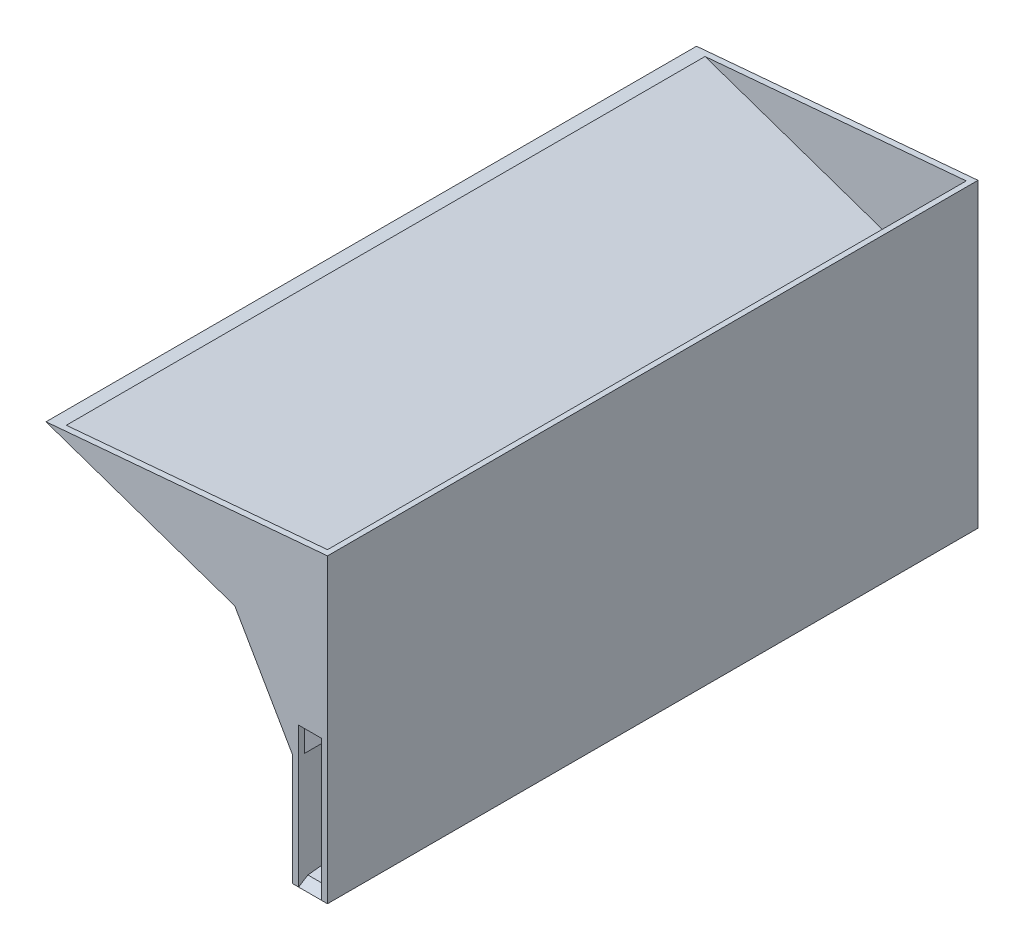
ISO-10303-21;
HEADER;
FILE_DESCRIPTION(('STEP AP214'),'2;1');
FILE_NAME('part.step','',(''),(''),'','','');
FILE_SCHEMA(('AUTOMOTIVE_DESIGN { 1 0 10303 214 1 1 1 1 }'));
ENDSEC;
DATA;
#1=APPLICATION_CONTEXT('core data for automotive mechanical design processes');
#2=APPLICATION_PROTOCOL_DEFINITION('international standard','automotive_design',2000,#1);
#3=PRODUCT_CONTEXT('',#1,'mechanical');
#4=PRODUCT('Part','Part','',(#3));
#5=PRODUCT_RELATED_PRODUCT_CATEGORY('part','',(#4));
#6=PRODUCT_DEFINITION_FORMATION('','',#4);
#7=PRODUCT_DEFINITION_CONTEXT('part definition',#1,'design');
#8=PRODUCT_DEFINITION('design','',#6,#7);
#9=PRODUCT_DEFINITION_SHAPE('','',#8);
#10=(LENGTH_UNIT() NAMED_UNIT(*) SI_UNIT(.MILLI.,.METRE.));
#11=(NAMED_UNIT(*) PLANE_ANGLE_UNIT() SI_UNIT($,.RADIAN.));
#12=(NAMED_UNIT(*) SI_UNIT($,.STERADIAN.) SOLID_ANGLE_UNIT());
#13=UNCERTAINTY_MEASURE_WITH_UNIT(LENGTH_MEASURE(1.E-05),#10,'distance_accuracy_value','');
#14=(GEOMETRIC_REPRESENTATION_CONTEXT(3) GLOBAL_UNCERTAINTY_ASSIGNED_CONTEXT((#13)) GLOBAL_UNIT_ASSIGNED_CONTEXT((#10,
#11,#12)) REPRESENTATION_CONTEXT('',''));
#15=CARTESIAN_POINT('',(0.,0.,0.));
#16=DIRECTION('',(0.,0.,1.));
#17=DIRECTION('',(1.,0.,0.));
#18=AXIS2_PLACEMENT_3D('',#15,#16,#17);
#19=CARTESIAN_POINT('',(12.7,-240.,701.675));
#20=DIRECTION('',(1.,0.,0.));
#21=DIRECTION('',(0.,0.,-1.));
#22=AXIS2_PLACEMENT_3D('',#19,#20,#21);
#23=PLANE('',#22);
#24=DIRECTION('',(0.,-1.,0.));
#25=VECTOR('',#24,1.);
#26=CARTESIAN_POINT('',(12.7,-227.3,701.675));
#27=LINE('',#26,#25);
#28=CARTESIAN_POINT('',(12.7,62.7,701.675));
#29=VERTEX_POINT('',#28);
#30=CARTESIAN_POINT('',(12.7,-240.,701.675));
#31=VERTEX_POINT('',#30);
#32=EDGE_CURVE('E69',#29,#31,#27,.T.);
#33=ORIENTED_EDGE('',*,*,#32,.T.);
#34=DIRECTION('',(0.,-0.536055885401432,0.844182496695168));
#35=VECTOR('',#34,1.);
#36=CARTESIAN_POINT('',(12.7,-227.3,681.675));
#37=LINE('',#36,#35);
#38=CARTESIAN_POINT('',(12.7,-227.3,681.675));
#39=VERTEX_POINT('',#38);
#40=EDGE_CURVE('E11',#31,#39,#37,.F.);
#41=ORIENTED_EDGE('',*,*,#40,.T.);
#42=DIRECTION('',(0.,-0.104528463267647,0.994521895368274));
#43=VECTOR('',#42,1.);
#44=CARTESIAN_POINT('',(12.7,-83.2388799331101,-688.975));
#45=LINE('',#44,#43);
#46=CARTESIAN_POINT('',(12.7,-83.2388799331101,-688.975));
#47=VERTEX_POINT('',#46);
#48=EDGE_CURVE('E158',#47,#39,#45,.T.);
#49=ORIENTED_EDGE('',*,*,#48,.F.);
#50=DIRECTION('',(0.,-1.,0.));
#51=VECTOR('',#50,1.);
#52=CARTESIAN_POINT('',(12.7,-240.,-688.975));
#53=LINE('',#52,#51);
#54=CARTESIAN_POINT('',(12.7,3.40295474387527,-688.975));
#55=VERTEX_POINT('',#54);
#56=EDGE_CURVE('E170',#55,#47,#53,.T.);
#57=ORIENTED_EDGE('',*,*,#56,.F.);
#58=DIRECTION('',(0.,0.,-1.));
#59=VECTOR('',#58,1.);
#60=CARTESIAN_POINT('',(12.7,3.40295474387527,701.675));
#61=LINE('',#60,#59);
#62=CARTESIAN_POINT('',(12.7,3.40295474387527,688.975));
#63=VERTEX_POINT('',#62);
#64=EDGE_CURVE('E190',#63,#55,#61,.T.);
#65=ORIENTED_EDGE('',*,*,#64,.F.);
#66=DIRECTION('',(0.,-1.,0.));
#67=VECTOR('',#66,1.);
#68=CARTESIAN_POINT('',(12.7,0.,688.975));
#69=LINE('',#68,#67);
#70=CARTESIAN_POINT('',(12.7,62.7,688.975));
#71=VERTEX_POINT('',#70);
#72=EDGE_CURVE('E295',#71,#63,#69,.T.);
#73=ORIENTED_EDGE('',*,*,#72,.F.);
#74=DIRECTION('',(0.,0.,1.));
#75=VECTOR('',#74,1.);
#76=CARTESIAN_POINT('',(12.7,62.7,681.675));
#77=LINE('',#76,#75);
#78=EDGE_CURVE('E180',#71,#29,#77,.T.);
#79=ORIENTED_EDGE('',*,*,#78,.T.);
#80=EDGE_LOOP('',(#33,#41,#49,#57,#65,#73,#79));
#81=FACE_BOUND('',#80,.T.);
#82=ADVANCED_FACE('F45',(#81),#23,.T.);
#83=CARTESIAN_POINT('',(62.2999999999999,410.,701.675));
#84=DIRECTION('',(-1.,0.,0.));
#85=DIRECTION('',(0.,-1.,0.));
#86=AXIS2_PLACEMENT_3D('',#83,#84,#85);
#87=PLANE('',#86);
#88=DIRECTION('',(0.,1.,0.));
#89=VECTOR('',#88,1.);
#90=CARTESIAN_POINT('',(62.2999999999999,410.,-688.975));
#91=LINE('',#90,#89);
#92=CARTESIAN_POINT('',(62.3,-83.2388799331101,-688.975));
#93=VERTEX_POINT('',#92);
#94=CARTESIAN_POINT('',(62.2999999999999,408.888893973221,-688.975));
#95=VERTEX_POINT('',#94);
#96=EDGE_CURVE('E179',#93,#95,#91,.T.);
#97=ORIENTED_EDGE('',*,*,#96,.F.);
#98=DIRECTION('',(0.,0.104528463267647,-0.994521895368274));
#99=VECTOR('',#98,1.);
#100=CARTESIAN_POINT('',(62.3,-83.2388799331101,-688.975));
#101=LINE('',#100,#99);
#102=CARTESIAN_POINT('',(62.3,-227.3,681.675));
#103=VERTEX_POINT('',#102);
#104=EDGE_CURVE('E161',#103,#93,#101,.T.);
#105=ORIENTED_EDGE('',*,*,#104,.F.);
#106=DIRECTION('',(0.,0.536055885401432,-0.844182496695168));
#107=VECTOR('',#106,1.);
#108=CARTESIAN_POINT('',(62.3,-227.3,681.675));
#109=LINE('',#108,#107);
#110=CARTESIAN_POINT('',(62.3,-240.,701.675));
#111=VERTEX_POINT('',#110);
#112=EDGE_CURVE('E55',#103,#111,#109,.F.);
#113=ORIENTED_EDGE('',*,*,#112,.T.);
#114=DIRECTION('',(0.,1.,0.));
#115=VECTOR('',#114,1.);
#116=CARTESIAN_POINT('',(62.3,-227.3,701.675));
#117=LINE('',#116,#115);
#118=CARTESIAN_POINT('',(62.3,62.7,701.675));
#119=VERTEX_POINT('',#118);
#120=EDGE_CURVE('E62',#111,#119,#117,.T.);
#121=ORIENTED_EDGE('',*,*,#120,.T.);
#122=DIRECTION('',(0.,0.,1.));
#123=VECTOR('',#122,1.);
#124=CARTESIAN_POINT('',(62.3,62.7,681.675));
#125=LINE('',#124,#123);
#126=CARTESIAN_POINT('',(62.3,62.7,688.975));
#127=VERTEX_POINT('',#126);
#128=EDGE_CURVE('E186',#127,#119,#125,.T.);
#129=ORIENTED_EDGE('',*,*,#128,.F.);
#130=DIRECTION('',(0.,1.,0.));
#131=VECTOR('',#130,1.);
#132=CARTESIAN_POINT('',(62.2999999999999,410.,688.975));
#133=LINE('',#132,#131);
#134=CARTESIAN_POINT('',(62.2999999999999,408.888893973221,688.975));
#135=VERTEX_POINT('',#134);
#136=EDGE_CURVE('E195',#127,#135,#133,.T.);
#137=ORIENTED_EDGE('',*,*,#136,.T.);
#138=DIRECTION('',(0.,0.,-1.));
#139=VECTOR('',#138,1.);
#140=CARTESIAN_POINT('',(62.2999999999999,408.888893973221,701.675));
#141=LINE('',#140,#139);
#142=EDGE_CURVE('E214',#135,#95,#141,.T.);
#143=ORIENTED_EDGE('',*,*,#142,.T.);
#144=EDGE_LOOP('',(#97,#105,#113,#121,#129,#137,#143));
#145=FACE_BOUND('',#144,.T.);
#146=ADVANCED_FACE('F300',(#145),#87,.T.);
#147=CARTESIAN_POINT('',(0.,0.,-688.975));
#148=DIRECTION('',(0.,0.,1.));
#149=DIRECTION('',(1.,0.,0.));
#150=AXIS2_PLACEMENT_3D('',#147,#148,#149);
#151=PLANE('',#150);
#152=ORIENTED_EDGE('',*,*,#56,.T.);
#153=DIRECTION('',(-1.,0.,0.));
#154=VECTOR('',#153,1.);
#155=CARTESIAN_POINT('',(1440.49992338373,-83.2388799331101,-688.975));
#156=LINE('',#155,#154);
#157=EDGE_CURVE('E154',#93,#47,#156,.T.);
#158=ORIENTED_EDGE('',*,*,#157,.F.);
#159=ORIENTED_EDGE('',*,*,#96,.T.);
#160=DIRECTION('',(-0.996194698091745,-0.0871557427476619,0.));
#161=VECTOR('',#160,1.);
#162=CARTESIAN_POINT('',(-532.280287956728,356.869859221025,-688.975));
#163=LINE('',#162,#161);
#164=CARTESIAN_POINT('',(-501.194225332028,359.589537294344,-688.975));
#165=VERTEX_POINT('',#164);
#166=EDGE_CURVE('E184',#95,#165,#163,.T.);
#167=ORIENTED_EDGE('',*,*,#166,.T.);
#168=DIRECTION('',(0.945428747100509,-0.32582891853849,0.));
#169=VECTOR('',#168,1.);
#170=CARTESIAN_POINT('',(-120.861972734562,228.513296034286,-688.975));
#171=LINE('',#170,#169);
#172=CARTESIAN_POINT('',(-116.374647054769,226.966801411755,-688.975));
#173=VERTEX_POINT('',#172);
#174=EDGE_CURVE('E205',#165,#173,#171,.T.);
#175=ORIENTED_EDGE('',*,*,#174,.T.);
#176=DIRECTION('',(0.500000000000001,-0.866025403784438,0.));
#177=VECTOR('',#176,1.);
#178=CARTESIAN_POINT('',(10.9985226280624,6.35000000000002,-688.975));
#179=LINE('',#178,#177);
#180=EDGE_CURVE('E177',#173,#55,#179,.T.);
#181=ORIENTED_EDGE('',*,*,#180,.T.);
#182=EDGE_LOOP('',(#152,#158,#159,#167,#175,#181));
#183=FACE_BOUND('',#182,.T.);
#184=ADVANCED_FACE('F175',(#183),#151,.T.);
#185=CARTESIAN_POINT('',(-532.280287956728,356.869859221025,701.675));
#186=DIRECTION('',(0.0871557427476619,-0.996194698091745,0.));
#187=DIRECTION('',(0.996194698091745,0.0871557427476619,0.));
#188=AXIS2_PLACEMENT_3D('',#185,#186,#187);
#189=PLANE('',#188);
#190=DIRECTION('',(-0.996194698091745,-0.0871557427476619,0.));
#191=VECTOR('',#190,1.);
#192=CARTESIAN_POINT('',(-532.280287956728,356.869859221025,-701.675));
#193=LINE('',#192,#191);
#194=CARTESIAN_POINT('',(74.9999999999999,410.,-701.675));
#195=VERTEX_POINT('',#194);
#196=CARTESIAN_POINT('',(-532.280287956728,356.869859221025,-701.675));
#197=VERTEX_POINT('',#196);
#198=EDGE_CURVE('E260',#195,#197,#193,.T.);
#199=ORIENTED_EDGE('',*,*,#198,.T.);
#200=DIRECTION('',(0.,0.,-1.));
#201=VECTOR('',#200,1.);
#202=CARTESIAN_POINT('',(-532.280287956728,356.869859221025,701.675));
#203=LINE('',#202,#201);
#204=CARTESIAN_POINT('',(-532.280287956728,356.869859221025,701.675));
#205=VERTEX_POINT('',#204);
#206=EDGE_CURVE('E275',#205,#197,#203,.T.);
#207=ORIENTED_EDGE('',*,*,#206,.F.);
#208=DIRECTION('',(-0.996194698091745,-0.0871557427476619,0.));
#209=VECTOR('',#208,1.);
#210=CARTESIAN_POINT('',(-532.280287956728,356.869859221025,701.675));
#211=LINE('',#210,#209);
#212=CARTESIAN_POINT('',(74.9999999999999,410.,701.675));
#213=VERTEX_POINT('',#212);
#214=EDGE_CURVE('E241',#213,#205,#211,.T.);
#215=ORIENTED_EDGE('',*,*,#214,.F.);
#216=DIRECTION('',(0.,0.,-1.));
#217=VECTOR('',#216,1.);
#218=CARTESIAN_POINT('',(74.9999999999999,410.,701.675));
#219=LINE('',#218,#217);
#220=EDGE_CURVE('E279',#213,#195,#219,.T.);
#221=ORIENTED_EDGE('',*,*,#220,.T.);
#222=EDGE_LOOP('',(#199,#207,#215,#221));
#223=FACE_BOUND('',#222,.T.);
#224=ORIENTED_EDGE('',*,*,#166,.F.);
#225=ORIENTED_EDGE('',*,*,#142,.F.);
#226=DIRECTION('',(-0.996194698091745,-0.0871557427476619,0.));
#227=VECTOR('',#226,1.);
#228=CARTESIAN_POINT('',(-532.280287956728,356.869859221025,688.975));
#229=LINE('',#228,#227);
#230=CARTESIAN_POINT('',(-501.194225332028,359.589537294344,688.975));
#231=VERTEX_POINT('',#230);
#232=EDGE_CURVE('E198',#135,#231,#229,.T.);
#233=ORIENTED_EDGE('',*,*,#232,.T.);
#234=DIRECTION('',(0.,0.,-1.));
#235=VECTOR('',#234,1.);
#236=CARTESIAN_POINT('',(-501.194225332028,359.589537294344,701.675));
#237=LINE('',#236,#235);
#238=EDGE_CURVE('E211',#231,#165,#237,.T.);
#239=ORIENTED_EDGE('',*,*,#238,.T.);
#240=EDGE_LOOP('',(#224,#225,#233,#239));
#241=FACE_BOUND('',#240,.T.);
#242=ADVANCED_FACE('F335',(#223,#241),#189,.F.);
#243=CARTESIAN_POINT('',(0.,-240.,701.675));
#244=DIRECTION('',(1.,0.,0.));
#245=DIRECTION('',(0.,0.,-1.));
#246=AXIS2_PLACEMENT_3D('',#243,#244,#245);
#247=PLANE('',#246);
#248=DIRECTION('',(0.,-1.,0.));
#249=VECTOR('',#248,1.);
#250=CARTESIAN_POINT('',(0.,-240.,-701.675));
#251=LINE('',#250,#249);
#252=CARTESIAN_POINT('',(0.,0.,-701.675));
#253=VERTEX_POINT('',#252);
#254=CARTESIAN_POINT('',(0.,-240.,-701.675));
#255=VERTEX_POINT('',#254);
#256=EDGE_CURVE('E218',#253,#255,#251,.T.);
#257=ORIENTED_EDGE('',*,*,#256,.T.);
#258=DIRECTION('',(0.,0.,-1.));
#259=VECTOR('',#258,1.);
#260=CARTESIAN_POINT('',(0.,-240.,701.675));
#261=LINE('',#260,#259);
#262=CARTESIAN_POINT('',(0.,-240.,701.675));
#263=VERTEX_POINT('',#262);
#264=EDGE_CURVE('E287',#263,#255,#261,.T.);
#265=ORIENTED_EDGE('',*,*,#264,.F.);
#266=DIRECTION('',(0.,-1.,0.));
#267=VECTOR('',#266,1.);
#268=CARTESIAN_POINT('',(0.,-240.,701.675));
#269=LINE('',#268,#267);
#270=CARTESIAN_POINT('',(0.,0.,701.675));
#271=VERTEX_POINT('',#270);
#272=EDGE_CURVE('E227',#271,#263,#269,.T.);
#273=ORIENTED_EDGE('',*,*,#272,.F.);
#274=DIRECTION('',(0.,0.,-1.));
#275=VECTOR('',#274,1.);
#276=CARTESIAN_POINT('',(0.,0.,701.675));
#277=LINE('',#276,#275);
#278=EDGE_CURVE('E250',#271,#253,#277,.T.);
#279=ORIENTED_EDGE('',*,*,#278,.T.);
#280=EDGE_LOOP('',(#257,#265,#273,#279));
#281=FACE_BOUND('',#280,.T.);
#282=ADVANCED_FACE('F398',(#281),#247,.F.);
#283=CARTESIAN_POINT('',(75.,-240.,701.675));
#284=DIRECTION('',(0.,1.,0.));
#285=DIRECTION('',(0.,0.,1.));
#286=AXIS2_PLACEMENT_3D('',#283,#284,#285);
#287=PLANE('',#286);
#288=DIRECTION('',(1.,0.,0.));
#289=VECTOR('',#288,1.);
#290=CARTESIAN_POINT('',(75.,-240.,-701.675));
#291=LINE('',#290,#289);
#292=CARTESIAN_POINT('',(75.,-240.,-701.675));
#293=VERTEX_POINT('',#292);
#294=EDGE_CURVE('E254',#255,#293,#291,.T.);
#295=ORIENTED_EDGE('',*,*,#294,.T.);
#296=DIRECTION('',(0.,0.,-1.));
#297=VECTOR('',#296,1.);
#298=CARTESIAN_POINT('',(75.,-240.,701.675));
#299=LINE('',#298,#297);
#300=CARTESIAN_POINT('',(75.,-240.,701.675));
#301=VERTEX_POINT('',#300);
#302=EDGE_CURVE('E283',#301,#293,#299,.T.);
#303=ORIENTED_EDGE('',*,*,#302,.F.);
#304=DIRECTION('',(1.,0.,0.));
#305=VECTOR('',#304,1.);
#306=CARTESIAN_POINT('',(75.,-240.,701.675));
#307=LINE('',#306,#305);
#308=EDGE_CURVE('E231',#111,#301,#307,.T.);
#309=ORIENTED_EDGE('',*,*,#308,.F.);
#310=EDGE_CURVE('E238',#31,#111,#307,.T.);
#311=ORIENTED_EDGE('',*,*,#310,.F.);
#312=EDGE_CURVE('E233',#263,#31,#307,.T.);
#313=ORIENTED_EDGE('',*,*,#312,.F.);
#314=ORIENTED_EDGE('',*,*,#264,.T.);
#315=EDGE_LOOP('',(#295,#303,#309,#311,#313,#314));
#316=FACE_BOUND('',#315,.T.);
#317=ADVANCED_FACE('F306',(#316),#287,.F.);
#318=CARTESIAN_POINT('',(74.9999999999999,410.,701.675));
#319=DIRECTION('',(-1.,0.,0.));
#320=DIRECTION('',(0.,-1.,0.));
#321=AXIS2_PLACEMENT_3D('',#318,#319,#320);
#322=PLANE('',#321);
#323=DIRECTION('',(0.,1.,0.));
#324=VECTOR('',#323,1.);
#325=CARTESIAN_POINT('',(74.9999999999999,410.,-701.675));
#326=LINE('',#325,#324);
#327=EDGE_CURVE('E257',#293,#195,#326,.T.);
#328=ORIENTED_EDGE('',*,*,#327,.T.);
#329=ORIENTED_EDGE('',*,*,#220,.F.);
#330=DIRECTION('',(0.,1.,0.));
#331=VECTOR('',#330,1.);
#332=CARTESIAN_POINT('',(74.9999999999999,410.,701.675));
#333=LINE('',#332,#331);
#334=EDGE_CURVE('E237',#301,#213,#333,.T.);
#335=ORIENTED_EDGE('',*,*,#334,.F.);
#336=ORIENTED_EDGE('',*,*,#302,.T.);
#337=EDGE_LOOP('',(#328,#329,#335,#336));
#338=FACE_BOUND('',#337,.T.);
#339=ADVANCED_FACE('F397',(#338),#322,.F.);
#340=CARTESIAN_POINT('',(-125.,216.50635094611,701.675));
#341=DIRECTION('',(0.32582891853849,0.945428747100509,0.));
#342=DIRECTION('',(-0.945428747100509,0.32582891853849,0.));
#343=AXIS2_PLACEMENT_3D('',#340,#341,#342);
#344=PLANE('',#343);
#345=DIRECTION('',(0.945428747100509,-0.32582891853849,0.));
#346=VECTOR('',#345,1.);
#347=CARTESIAN_POINT('',(-125.,216.50635094611,-701.675));
#348=LINE('',#347,#346);
#349=CARTESIAN_POINT('',(-125.,216.50635094611,-701.675));
#350=VERTEX_POINT('',#349);
#351=EDGE_CURVE('E263',#197,#350,#348,.T.);
#352=ORIENTED_EDGE('',*,*,#351,.T.);
#353=DIRECTION('',(0.,0.,-1.));
#354=VECTOR('',#353,1.);
#355=CARTESIAN_POINT('',(-125.,216.50635094611,701.675));
#356=LINE('',#355,#354);
#357=CARTESIAN_POINT('',(-125.,216.50635094611,701.675));
#358=VERTEX_POINT('',#357);
#359=EDGE_CURVE('E271',#358,#350,#356,.T.);
#360=ORIENTED_EDGE('',*,*,#359,.F.);
#361=DIRECTION('',(0.945428747100509,-0.32582891853849,0.));
#362=VECTOR('',#361,1.);
#363=CARTESIAN_POINT('',(-125.,216.50635094611,701.675));
#364=LINE('',#363,#362);
#365=EDGE_CURVE('E244',#205,#358,#364,.T.);
#366=ORIENTED_EDGE('',*,*,#365,.F.);
#367=ORIENTED_EDGE('',*,*,#206,.T.);
#368=EDGE_LOOP('',(#352,#360,#366,#367));
#369=FACE_BOUND('',#368,.T.);
#370=ADVANCED_FACE('F470',(#369),#344,.F.);
#371=CARTESIAN_POINT('',(0.,0.,701.675));
#372=DIRECTION('',(0.866025403784438,0.500000000000001,0.));
#373=DIRECTION('',(-0.500000000000001,0.866025403784438,0.));
#374=AXIS2_PLACEMENT_3D('',#371,#372,#373);
#375=PLANE('',#374);
#376=DIRECTION('',(0.500000000000001,-0.866025403784438,0.));
#377=VECTOR('',#376,1.);
#378=CARTESIAN_POINT('',(0.,0.,-701.675));
#379=LINE('',#378,#377);
#380=EDGE_CURVE('E232',#350,#253,#379,.T.);
#381=ORIENTED_EDGE('',*,*,#380,.T.);
#382=ORIENTED_EDGE('',*,*,#278,.F.);
#383=DIRECTION('',(0.500000000000001,-0.866025403784438,0.));
#384=VECTOR('',#383,1.);
#385=CARTESIAN_POINT('',(0.,0.,701.675));
#386=LINE('',#385,#384);
#387=EDGE_CURVE('E247',#358,#271,#386,.T.);
#388=ORIENTED_EDGE('',*,*,#387,.F.);
#389=ORIENTED_EDGE('',*,*,#359,.T.);
#390=EDGE_LOOP('',(#381,#382,#388,#389));
#391=FACE_BOUND('',#390,.T.);
#392=ADVANCED_FACE('F383',(#391),#375,.F.);
#393=CARTESIAN_POINT('',(0.,0.,701.675));
#394=DIRECTION('',(0.,0.,1.));
#395=DIRECTION('',(1.,0.,0.));
#396=AXIS2_PLACEMENT_3D('',#393,#394,#395);
#397=PLANE('',#396);
#398=ORIENTED_EDGE('',*,*,#120,.F.);
#399=ORIENTED_EDGE('',*,*,#308,.T.);
#400=ORIENTED_EDGE('',*,*,#334,.T.);
#401=ORIENTED_EDGE('',*,*,#214,.T.);
#402=ORIENTED_EDGE('',*,*,#365,.T.);
#403=ORIENTED_EDGE('',*,*,#387,.T.);
#404=ORIENTED_EDGE('',*,*,#272,.T.);
#405=ORIENTED_EDGE('',*,*,#312,.T.);
#406=ORIENTED_EDGE('',*,*,#32,.F.);
#407=DIRECTION('',(-1.,0.,0.));
#408=VECTOR('',#407,1.);
#409=CARTESIAN_POINT('',(12.7,62.7,701.675));
#410=LINE('',#409,#408);
#411=EDGE_CURVE('E319',#119,#29,#410,.T.);
#412=ORIENTED_EDGE('',*,*,#411,.F.);
#413=EDGE_LOOP('',(#398,#399,#400,#401,#402,#403,#404,#405,#406,#412));
#414=FACE_BOUND('',#413,.T.);
#415=ADVANCED_FACE('F378',(#414),#397,.T.);
#416=CARTESIAN_POINT('',(0.,0.,-701.675));
#417=DIRECTION('',(0.,0.,1.));
#418=DIRECTION('',(1.,0.,0.));
#419=AXIS2_PLACEMENT_3D('',#416,#417,#418);
#420=PLANE('',#419);
#421=ORIENTED_EDGE('',*,*,#256,.F.);
#422=ORIENTED_EDGE('',*,*,#380,.F.);
#423=ORIENTED_EDGE('',*,*,#351,.F.);
#424=ORIENTED_EDGE('',*,*,#198,.F.);
#425=ORIENTED_EDGE('',*,*,#327,.F.);
#426=ORIENTED_EDGE('',*,*,#294,.F.);
#427=EDGE_LOOP('',(#421,#422,#423,#424,#425,#426));
#428=FACE_BOUND('',#427,.T.);
#429=ADVANCED_FACE('F349',(#428),#420,.F.);
#430=CARTESIAN_POINT('',(-120.861972734562,228.513296034286,701.675));
#431=DIRECTION('',(0.32582891853849,0.945428747100509,0.));
#432=DIRECTION('',(-0.945428747100509,0.32582891853849,0.));
#433=AXIS2_PLACEMENT_3D('',#430,#431,#432);
#434=PLANE('',#433);
#435=ORIENTED_EDGE('',*,*,#174,.F.);
#436=ORIENTED_EDGE('',*,*,#238,.F.);
#437=DIRECTION('',(0.945428747100509,-0.32582891853849,0.));
#438=VECTOR('',#437,1.);
#439=CARTESIAN_POINT('',(-120.861972734562,228.513296034286,688.975));
#440=LINE('',#439,#438);
#441=CARTESIAN_POINT('',(-116.374647054769,226.966801411755,688.975));
#442=VERTEX_POINT('',#441);
#443=EDGE_CURVE('E199',#231,#442,#440,.T.);
#444=ORIENTED_EDGE('',*,*,#443,.T.);
#445=DIRECTION('',(0.,0.,-1.));
#446=VECTOR('',#445,1.);
#447=CARTESIAN_POINT('',(-116.374647054769,226.966801411755,701.675));
#448=LINE('',#447,#446);
#449=EDGE_CURVE('E192',#442,#173,#448,.T.);
#450=ORIENTED_EDGE('',*,*,#449,.T.);
#451=EDGE_LOOP('',(#435,#436,#444,#450));
#452=FACE_BOUND('',#451,.T.);
#453=ADVANCED_FACE('F338',(#452),#434,.T.);
#454=CARTESIAN_POINT('',(10.9985226280624,6.35000000000002,701.675));
#455=DIRECTION('',(0.866025403784438,0.500000000000001,0.));
#456=DIRECTION('',(-0.500000000000001,0.866025403784438,0.));
#457=AXIS2_PLACEMENT_3D('',#454,#455,#456);
#458=PLANE('',#457);
#459=ORIENTED_EDGE('',*,*,#180,.F.);
#460=ORIENTED_EDGE('',*,*,#449,.F.);
#461=DIRECTION('',(0.500000000000001,-0.866025403784438,0.));
#462=VECTOR('',#461,1.);
#463=CARTESIAN_POINT('',(10.9985226280624,6.35000000000002,688.975));
#464=LINE('',#463,#462);
#465=EDGE_CURVE('E193',#442,#63,#464,.T.);
#466=ORIENTED_EDGE('',*,*,#465,.T.);
#467=ORIENTED_EDGE('',*,*,#64,.T.);
#468=EDGE_LOOP('',(#459,#460,#466,#467));
#469=FACE_BOUND('',#468,.T.);
#470=ADVANCED_FACE('F341',(#469),#458,.T.);
#471=CARTESIAN_POINT('',(0.,0.,688.975));
#472=DIRECTION('',(0.,0.,1.));
#473=DIRECTION('',(1.,0.,0.));
#474=AXIS2_PLACEMENT_3D('',#471,#472,#473);
#475=PLANE('',#474);
#476=DIRECTION('',(-1.,0.,0.));
#477=VECTOR('',#476,1.);
#478=CARTESIAN_POINT('',(0.,62.7,688.975));
#479=LINE('',#478,#477);
#480=EDGE_CURVE('E291',#127,#71,#479,.T.);
#481=ORIENTED_EDGE('',*,*,#480,.T.);
#482=ORIENTED_EDGE('',*,*,#72,.T.);
#483=ORIENTED_EDGE('',*,*,#465,.F.);
#484=ORIENTED_EDGE('',*,*,#443,.F.);
#485=ORIENTED_EDGE('',*,*,#232,.F.);
#486=ORIENTED_EDGE('',*,*,#136,.F.);
#487=EDGE_LOOP('',(#481,#482,#483,#484,#485,#486));
#488=FACE_BOUND('',#487,.T.);
#489=ADVANCED_FACE('F329',(#488),#475,.F.);
#490=CARTESIAN_POINT('',(12.7,62.7,681.675));
#491=DIRECTION('',(0.,1.,0.));
#492=DIRECTION('',(0.,0.,1.));
#493=AXIS2_PLACEMENT_3D('',#490,#491,#492);
#494=PLANE('',#493);
#495=ORIENTED_EDGE('',*,*,#128,.T.);
#496=ORIENTED_EDGE('',*,*,#411,.T.);
#497=ORIENTED_EDGE('',*,*,#78,.F.);
#498=ORIENTED_EDGE('',*,*,#480,.F.);
#499=EDGE_LOOP('',(#495,#496,#497,#498));
#500=FACE_BOUND('',#499,.T.);
#501=ADVANCED_FACE('F325',(#500),#494,.F.);
#502=CARTESIAN_POINT('',(1440.49992338373,-83.2388799331101,-688.975));
#503=DIRECTION('',(0.,-0.994521895368274,-0.104528463267647));
#504=DIRECTION('',(0.,0.104528463267647,-0.994521895368274));
#505=AXIS2_PLACEMENT_3D('',#502,#503,#504);
#506=PLANE('',#505);
#507=DIRECTION('',(-1.,0.,0.));
#508=VECTOR('',#507,1.);
#509=CARTESIAN_POINT('',(1440.49992338373,-227.3,681.675));
#510=LINE('',#509,#508);
#511=EDGE_CURVE('E166',#103,#39,#510,.T.);
#512=ORIENTED_EDGE('',*,*,#511,.F.);
#513=ORIENTED_EDGE('',*,*,#104,.T.);
#514=ORIENTED_EDGE('',*,*,#157,.T.);
#515=ORIENTED_EDGE('',*,*,#48,.T.);
#516=EDGE_LOOP('',(#512,#513,#514,#515));
#517=FACE_BOUND('',#516,.T.);
#518=ADVANCED_FACE('F157',(#517),#506,.F.);
#519=CARTESIAN_POINT('',(75.,-227.3,681.675));
#520=DIRECTION('',(0.,-0.844182496695168,-0.536055885401432));
#521=DIRECTION('',(1.,0.,0.));
#522=AXIS2_PLACEMENT_3D('',#519,#520,#521);
#523=PLANE('',#522);
#524=ORIENTED_EDGE('',*,*,#40,.F.);
#525=ORIENTED_EDGE('',*,*,#310,.T.);
#526=ORIENTED_EDGE('',*,*,#112,.F.);
#527=ORIENTED_EDGE('',*,*,#511,.T.);
#528=EDGE_LOOP('',(#524,#525,#526,#527));
#529=FACE_BOUND('',#528,.T.);
#530=ADVANCED_FACE('F48',(#529),#523,.F.);
#531=CLOSED_SHELL('',(#82,#146,#184,#242,#282,#317,#339,#370,#392,#415,#429,#453,#470,#489,#501,
#518,#530));
#532=MANIFOLD_SOLID_BREP('B2',#531);
#533=ADVANCED_BREP_SHAPE_REPRESENTATION('',(#18,#532),#14);
#534=SHAPE_DEFINITION_REPRESENTATION(#9,#533);
ENDSEC;
END-ISO-10303-21;
